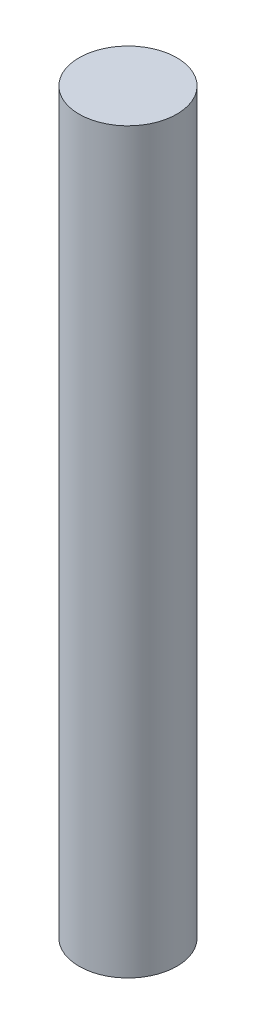
ISO-10303-21;
HEADER;
FILE_DESCRIPTION(('STEP AP214'),'2;1');
FILE_NAME('part.step','',(''),(''),'','','');
FILE_SCHEMA(('AUTOMOTIVE_DESIGN { 1 0 10303 214 1 1 1 1 }'));
ENDSEC;
DATA;
#1=APPLICATION_CONTEXT('core data for automotive mechanical design processes');
#2=APPLICATION_PROTOCOL_DEFINITION('international standard','automotive_design',2000,#1);
#3=PRODUCT_CONTEXT('',#1,'mechanical');
#4=PRODUCT('Part','Part','',(#3));
#5=PRODUCT_RELATED_PRODUCT_CATEGORY('part','',(#4));
#6=PRODUCT_DEFINITION_FORMATION('','',#4);
#7=PRODUCT_DEFINITION_CONTEXT('part definition',#1,'design');
#8=PRODUCT_DEFINITION('design','',#6,#7);
#9=PRODUCT_DEFINITION_SHAPE('','',#8);
#10=(LENGTH_UNIT() NAMED_UNIT(*) SI_UNIT(.MILLI.,.METRE.));
#11=(NAMED_UNIT(*) PLANE_ANGLE_UNIT() SI_UNIT($,.RADIAN.));
#12=(NAMED_UNIT(*) SI_UNIT($,.STERADIAN.) SOLID_ANGLE_UNIT());
#13=UNCERTAINTY_MEASURE_WITH_UNIT(LENGTH_MEASURE(1.E-05),#10,'distance_accuracy_value','');
#14=(GEOMETRIC_REPRESENTATION_CONTEXT(3) GLOBAL_UNCERTAINTY_ASSIGNED_CONTEXT((#13)) GLOBAL_UNIT_ASSIGNED_CONTEXT((#10,
#11,#12)) REPRESENTATION_CONTEXT('',''));
#15=CARTESIAN_POINT('',(0.,0.,0.));
#16=DIRECTION('',(0.,0.,1.));
#17=DIRECTION('',(1.,0.,0.));
#18=AXIS2_PLACEMENT_3D('',#15,#16,#17);
#19=CARTESIAN_POINT('',(-72.3175050809045,4.,-6.78747914581868));
#20=DIRECTION('',(0.,-1.,0.));
#21=DIRECTION('',(0.,0.,-1.));
#22=AXIS2_PLACEMENT_3D('',#19,#20,#21);
#23=CYLINDRICAL_SURFACE('',#22,0.265000000000001);
#24=CARTESIAN_POINT('',(-72.3175050809045,4.,-6.78747914581868));
#25=DIRECTION('',(0.,1.,0.));
#26=DIRECTION('',(0.,0.,1.));
#27=AXIS2_PLACEMENT_3D('',#24,#25,#26);
#28=CIRCLE('',#27,0.265000000000001);
#29=CARTESIAN_POINT('',(-72.3175050809045,4.,-6.52247914581867));
#30=VERTEX_POINT('',#29);
#31=EDGE_CURVE('E10',#30,#30,#28,.T.);
#32=ORIENTED_EDGE('',*,*,#31,.F.);
#33=EDGE_LOOP('',(#32));
#34=FACE_BOUND('',#33,.T.);
#35=CARTESIAN_POINT('',(-72.3175050809045,0.,-6.78747914581868));
#36=DIRECTION('',(0.,1.,0.));
#37=DIRECTION('',(0.,0.,1.));
#38=AXIS2_PLACEMENT_3D('',#35,#36,#37);
#39=CIRCLE('',#38,0.265000000000001);
#40=CARTESIAN_POINT('',(-72.3175050809045,0.,-6.52247914581867));
#41=VERTEX_POINT('',#40);
#42=EDGE_CURVE('E40',#41,#41,#39,.T.);
#43=ORIENTED_EDGE('',*,*,#42,.T.);
#44=EDGE_LOOP('',(#43));
#45=FACE_BOUND('',#44,.T.);
#46=ADVANCED_FACE('F37',(#34,#45),#23,.T.);
#47=CARTESIAN_POINT('',(-72.3175050809045,4.,-6.78747914581868));
#48=DIRECTION('',(0.,1.,0.));
#49=DIRECTION('',(0.,0.,1.));
#50=AXIS2_PLACEMENT_3D('',#47,#48,#49);
#51=PLANE('',#50);
#52=ORIENTED_EDGE('',*,*,#31,.T.);
#53=EDGE_LOOP('',(#52));
#54=FACE_BOUND('',#53,.T.);
#55=ADVANCED_FACE('F54',(#54),#51,.T.);
#56=CARTESIAN_POINT('',(-72.3175050809045,0.,-6.78747914581868));
#57=DIRECTION('',(0.,1.,0.));
#58=DIRECTION('',(0.,0.,1.));
#59=AXIS2_PLACEMENT_3D('',#56,#57,#58);
#60=PLANE('',#59);
#61=ORIENTED_EDGE('',*,*,#42,.F.);
#62=EDGE_LOOP('',(#61));
#63=FACE_BOUND('',#62,.T.);
#64=ADVANCED_FACE('F52',(#63),#60,.F.);
#65=CLOSED_SHELL('',(#46,#55,#64));
#66=MANIFOLD_SOLID_BREP('B2',#65);
#67=ADVANCED_BREP_SHAPE_REPRESENTATION('',(#18,#66),#14);
#68=SHAPE_DEFINITION_REPRESENTATION(#9,#67);
ENDSEC;
END-ISO-10303-21;
